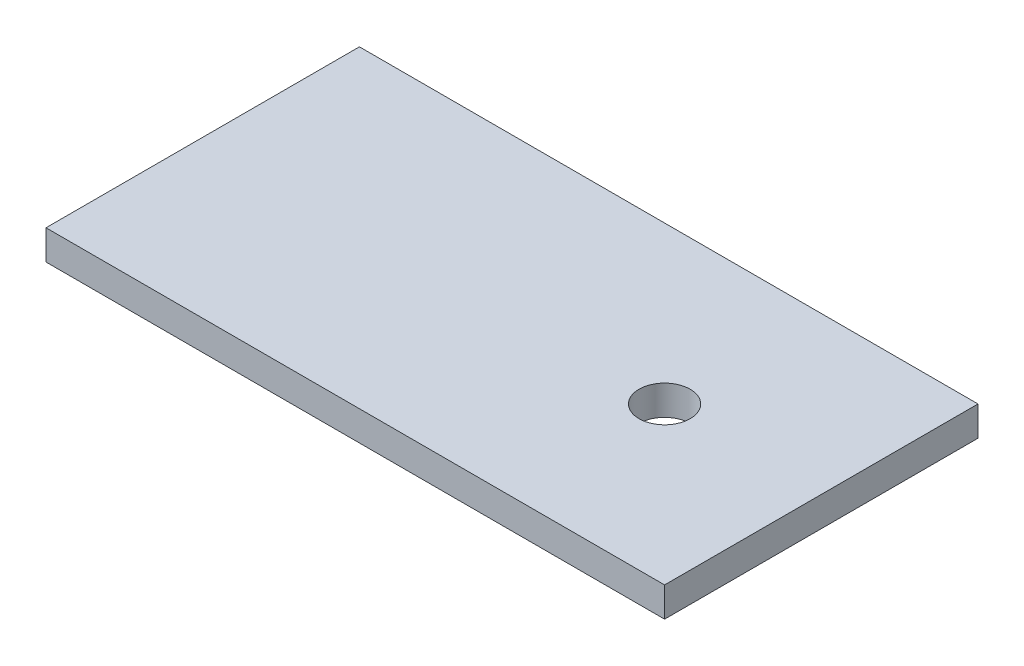
ISO-10303-21;
HEADER;
FILE_DESCRIPTION(('STEP AP214'),'2;1');
FILE_NAME('part.step','',(''),(''),'','','');
FILE_SCHEMA(('AUTOMOTIVE_DESIGN { 1 0 10303 214 1 1 1 1 }'));
ENDSEC;
DATA;
#1=APPLICATION_CONTEXT('core data for automotive mechanical design processes');
#2=APPLICATION_PROTOCOL_DEFINITION('international standard','automotive_design',2000,#1);
#3=PRODUCT_CONTEXT('',#1,'mechanical');
#4=PRODUCT('Part','Part','',(#3));
#5=PRODUCT_RELATED_PRODUCT_CATEGORY('part','',(#4));
#6=PRODUCT_DEFINITION_FORMATION('','',#4);
#7=PRODUCT_DEFINITION_CONTEXT('part definition',#1,'design');
#8=PRODUCT_DEFINITION('design','',#6,#7);
#9=PRODUCT_DEFINITION_SHAPE('','',#8);
#10=(LENGTH_UNIT() NAMED_UNIT(*) SI_UNIT(.MILLI.,.METRE.));
#11=(NAMED_UNIT(*) PLANE_ANGLE_UNIT() SI_UNIT($,.RADIAN.));
#12=(NAMED_UNIT(*) SI_UNIT($,.STERADIAN.) SOLID_ANGLE_UNIT());
#13=UNCERTAINTY_MEASURE_WITH_UNIT(LENGTH_MEASURE(1.E-05),#10,'distance_accuracy_value','');
#14=(GEOMETRIC_REPRESENTATION_CONTEXT(3) GLOBAL_UNCERTAINTY_ASSIGNED_CONTEXT((#13)) GLOBAL_UNIT_ASSIGNED_CONTEXT((#10,
#11,#12)) REPRESENTATION_CONTEXT('',''));
#15=CARTESIAN_POINT('',(0.,0.,0.));
#16=DIRECTION('',(0.,0.,1.));
#17=DIRECTION('',(1.,0.,0.));
#18=AXIS2_PLACEMENT_3D('',#15,#16,#17);
#19=CARTESIAN_POINT('',(-187.5,18.,-95.));
#20=DIRECTION('',(1.,0.,0.));
#21=DIRECTION('',(0.,0.,-1.));
#22=AXIS2_PLACEMENT_3D('',#19,#20,#21);
#23=PLANE('',#22);
#24=DIRECTION('',(0.,0.,1.));
#25=VECTOR('',#24,1.);
#26=CARTESIAN_POINT('',(-187.5,0.,-95.));
#27=LINE('',#26,#25);
#28=CARTESIAN_POINT('',(-187.5,0.,-95.));
#29=VERTEX_POINT('',#28);
#30=CARTESIAN_POINT('',(-187.5,0.,95.));
#31=VERTEX_POINT('',#30);
#32=EDGE_CURVE('E107',#29,#31,#27,.T.);
#33=ORIENTED_EDGE('',*,*,#32,.T.);
#34=DIRECTION('',(0.,-1.,0.));
#35=VECTOR('',#34,1.);
#36=CARTESIAN_POINT('',(-187.5,18.,95.));
#37=LINE('',#36,#35);
#38=CARTESIAN_POINT('',(-187.5,18.,95.));
#39=VERTEX_POINT('',#38);
#40=EDGE_CURVE('E11',#39,#31,#37,.T.);
#41=ORIENTED_EDGE('',*,*,#40,.F.);
#42=DIRECTION('',(0.,0.,1.));
#43=VECTOR('',#42,1.);
#44=CARTESIAN_POINT('',(-187.5,18.,-95.));
#45=LINE('',#44,#43);
#46=CARTESIAN_POINT('',(-187.5,18.,-95.));
#47=VERTEX_POINT('',#46);
#48=EDGE_CURVE('E91',#47,#39,#45,.T.);
#49=ORIENTED_EDGE('',*,*,#48,.F.);
#50=DIRECTION('',(0.,-1.,0.));
#51=VECTOR('',#50,1.);
#52=CARTESIAN_POINT('',(-187.5,18.,-95.));
#53=LINE('',#52,#51);
#54=EDGE_CURVE('E103',#47,#29,#53,.T.);
#55=ORIENTED_EDGE('',*,*,#54,.T.);
#56=EDGE_LOOP('',(#33,#41,#49,#55));
#57=FACE_BOUND('',#56,.T.);
#58=ADVANCED_FACE('F39',(#57),#23,.F.);
#59=CARTESIAN_POINT('',(-187.5,18.,95.));
#60=DIRECTION('',(0.,0.,-1.));
#61=DIRECTION('',(-1.,0.,0.));
#62=AXIS2_PLACEMENT_3D('',#59,#60,#61);
#63=PLANE('',#62);
#64=DIRECTION('',(1.,0.,0.));
#65=VECTOR('',#64,1.);
#66=CARTESIAN_POINT('',(-187.5,0.,95.));
#67=LINE('',#66,#65);
#68=CARTESIAN_POINT('',(187.5,0.,95.));
#69=VERTEX_POINT('',#68);
#70=EDGE_CURVE('E96',#31,#69,#67,.T.);
#71=ORIENTED_EDGE('',*,*,#70,.T.);
#72=DIRECTION('',(0.,-1.,0.));
#73=VECTOR('',#72,1.);
#74=CARTESIAN_POINT('',(187.5,18.,95.));
#75=LINE('',#74,#73);
#76=CARTESIAN_POINT('',(187.5,18.,95.));
#77=VERTEX_POINT('',#76);
#78=EDGE_CURVE('E48',#77,#69,#75,.T.);
#79=ORIENTED_EDGE('',*,*,#78,.F.);
#80=DIRECTION('',(1.,0.,0.));
#81=VECTOR('',#80,1.);
#82=CARTESIAN_POINT('',(-187.5,18.,95.));
#83=LINE('',#82,#81);
#84=EDGE_CURVE('E86',#39,#77,#83,.T.);
#85=ORIENTED_EDGE('',*,*,#84,.F.);
#86=ORIENTED_EDGE('',*,*,#40,.T.);
#87=EDGE_LOOP('',(#71,#79,#85,#86));
#88=FACE_BOUND('',#87,.T.);
#89=ADVANCED_FACE('F95',(#88),#63,.F.);
#90=CARTESIAN_POINT('',(187.5,18.,-95.));
#91=DIRECTION('',(-1.,0.,0.));
#92=DIRECTION('',(0.,0.,1.));
#93=AXIS2_PLACEMENT_3D('',#90,#91,#92);
#94=PLANE('',#93);
#95=DIRECTION('',(0.,0.,-1.));
#96=VECTOR('',#95,1.);
#97=CARTESIAN_POINT('',(187.5,0.,-95.));
#98=LINE('',#97,#96);
#99=CARTESIAN_POINT('',(187.5,0.,-95.));
#100=VERTEX_POINT('',#99);
#101=EDGE_CURVE('E73',#69,#100,#98,.T.);
#102=ORIENTED_EDGE('',*,*,#101,.T.);
#103=DIRECTION('',(0.,-1.,0.));
#104=VECTOR('',#103,1.);
#105=CARTESIAN_POINT('',(187.5,18.,-95.));
#106=LINE('',#105,#104);
#107=CARTESIAN_POINT('',(187.5,18.,-95.));
#108=VERTEX_POINT('',#107);
#109=EDGE_CURVE('E98',#108,#100,#106,.T.);
#110=ORIENTED_EDGE('',*,*,#109,.F.);
#111=DIRECTION('',(0.,0.,-1.));
#112=VECTOR('',#111,1.);
#113=CARTESIAN_POINT('',(187.5,18.,-95.));
#114=LINE('',#113,#112);
#115=EDGE_CURVE('E89',#77,#108,#114,.T.);
#116=ORIENTED_EDGE('',*,*,#115,.F.);
#117=ORIENTED_EDGE('',*,*,#78,.T.);
#118=EDGE_LOOP('',(#102,#110,#116,#117));
#119=FACE_BOUND('',#118,.T.);
#120=ADVANCED_FACE('F99',(#119),#94,.F.);
#121=CARTESIAN_POINT('',(-187.5,18.,-95.));
#122=DIRECTION('',(0.,0.,1.));
#123=DIRECTION('',(1.,0.,0.));
#124=AXIS2_PLACEMENT_3D('',#121,#122,#123);
#125=PLANE('',#124);
#126=DIRECTION('',(-1.,0.,0.));
#127=VECTOR('',#126,1.);
#128=CARTESIAN_POINT('',(-187.5,0.,-95.));
#129=LINE('',#128,#127);
#130=EDGE_CURVE('E79',#100,#29,#129,.T.);
#131=ORIENTED_EDGE('',*,*,#130,.T.);
#132=ORIENTED_EDGE('',*,*,#54,.F.);
#133=DIRECTION('',(-1.,0.,0.));
#134=VECTOR('',#133,1.);
#135=CARTESIAN_POINT('',(-187.5,18.,-95.));
#136=LINE('',#135,#134);
#137=EDGE_CURVE('E56',#108,#47,#136,.T.);
#138=ORIENTED_EDGE('',*,*,#137,.F.);
#139=ORIENTED_EDGE('',*,*,#109,.T.);
#140=EDGE_LOOP('',(#131,#132,#138,#139));
#141=FACE_BOUND('',#140,.T.);
#142=ADVANCED_FACE('F121',(#141),#125,.F.);
#143=CARTESIAN_POINT('',(0.,18.,0.));
#144=DIRECTION('',(0.,1.,0.));
#145=DIRECTION('',(0.,0.,1.));
#146=AXIS2_PLACEMENT_3D('',#143,#144,#145);
#147=PLANE('',#146);
#148=CARTESIAN_POINT('',(92.5,18.,0.));
#149=DIRECTION('',(0.,1.,0.));
#150=DIRECTION('',(0.,0.,1.));
#151=AXIS2_PLACEMENT_3D('',#148,#149,#150);
#152=CIRCLE('',#151,15.5);
#153=CARTESIAN_POINT('',(92.5,18.,15.5));
#154=VERTEX_POINT('',#153);
#155=EDGE_CURVE('E128',#154,#154,#152,.T.);
#156=ORIENTED_EDGE('',*,*,#155,.F.);
#157=EDGE_LOOP('',(#156));
#158=FACE_BOUND('',#157,.T.);
#159=ORIENTED_EDGE('',*,*,#48,.T.);
#160=ORIENTED_EDGE('',*,*,#84,.T.);
#161=ORIENTED_EDGE('',*,*,#115,.T.);
#162=ORIENTED_EDGE('',*,*,#137,.T.);
#163=EDGE_LOOP('',(#159,#160,#161,#162));
#164=FACE_BOUND('',#163,.T.);
#165=ADVANCED_FACE('F87',(#158,#164),#147,.T.);
#166=CARTESIAN_POINT('',(0.,0.,0.));
#167=DIRECTION('',(0.,1.,0.));
#168=DIRECTION('',(0.,0.,1.));
#169=AXIS2_PLACEMENT_3D('',#166,#167,#168);
#170=PLANE('',#169);
#171=CARTESIAN_POINT('',(92.5,0.,0.));
#172=DIRECTION('',(0.,1.,0.));
#173=DIRECTION('',(0.,0.,1.));
#174=AXIS2_PLACEMENT_3D('',#171,#172,#173);
#175=CIRCLE('',#174,15.5);
#176=CARTESIAN_POINT('',(92.5,0.,15.5));
#177=VERTEX_POINT('',#176);
#178=EDGE_CURVE('E111',#177,#177,#175,.T.);
#179=ORIENTED_EDGE('',*,*,#178,.T.);
#180=EDGE_LOOP('',(#179));
#181=FACE_BOUND('',#180,.T.);
#182=ORIENTED_EDGE('',*,*,#32,.F.);
#183=ORIENTED_EDGE('',*,*,#130,.F.);
#184=ORIENTED_EDGE('',*,*,#101,.F.);
#185=ORIENTED_EDGE('',*,*,#70,.F.);
#186=EDGE_LOOP('',(#182,#183,#184,#185));
#187=FACE_BOUND('',#186,.T.);
#188=ADVANCED_FACE('F124',(#181,#187),#170,.F.);
#189=CARTESIAN_POINT('',(92.5,0.,0.));
#190=DIRECTION('',(0.,1.,0.));
#191=DIRECTION('',(0.,0.,1.));
#192=AXIS2_PLACEMENT_3D('',#189,#190,#191);
#193=CYLINDRICAL_SURFACE('',#192,15.5);
#194=ORIENTED_EDGE('',*,*,#178,.F.);
#195=EDGE_LOOP('',(#194));
#196=FACE_BOUND('',#195,.T.);
#197=ORIENTED_EDGE('',*,*,#155,.T.);
#198=EDGE_LOOP('',(#197));
#199=FACE_BOUND('',#198,.T.);
#200=ADVANCED_FACE('F137',(#196,#199),#193,.F.);
#201=CLOSED_SHELL('',(#58,#89,#120,#142,#165,#188,#200));
#202=MANIFOLD_SOLID_BREP('B2',#201);
#203=ADVANCED_BREP_SHAPE_REPRESENTATION('',(#18,#202),#14);
#204=SHAPE_DEFINITION_REPRESENTATION(#9,#203);
ENDSEC;
END-ISO-10303-21;
